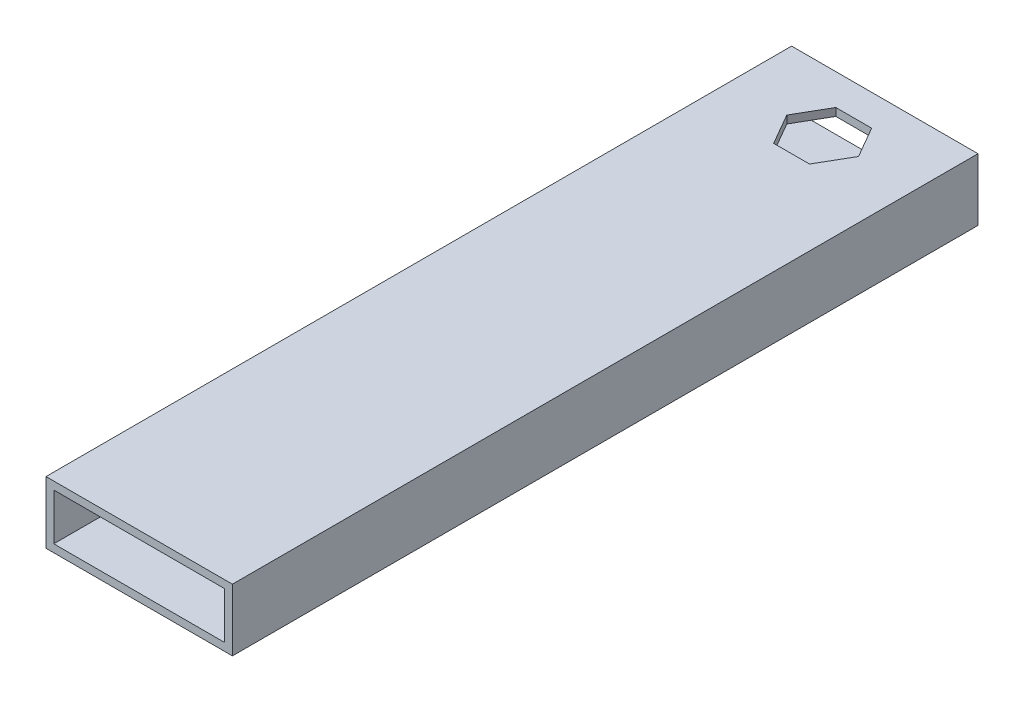
ISO-10303-21;
HEADER;
FILE_DESCRIPTION(('STEP AP214'),'2;1');
FILE_NAME('part.step','',(''),(''),'','','');
FILE_SCHEMA(('AUTOMOTIVE_DESIGN { 1 0 10303 214 1 1 1 1 }'));
ENDSEC;
DATA;
#1=APPLICATION_CONTEXT('core data for automotive mechanical design processes');
#2=APPLICATION_PROTOCOL_DEFINITION('international standard','automotive_design',2000,#1);
#3=PRODUCT_CONTEXT('',#1,'mechanical');
#4=PRODUCT('Part','Part','',(#3));
#5=PRODUCT_RELATED_PRODUCT_CATEGORY('part','',(#4));
#6=PRODUCT_DEFINITION_FORMATION('','',#4);
#7=PRODUCT_DEFINITION_CONTEXT('part definition',#1,'design');
#8=PRODUCT_DEFINITION('design','',#6,#7);
#9=PRODUCT_DEFINITION_SHAPE('','',#8);
#10=(LENGTH_UNIT() NAMED_UNIT(*) SI_UNIT(.MILLI.,.METRE.));
#11=(NAMED_UNIT(*) PLANE_ANGLE_UNIT() SI_UNIT($,.RADIAN.));
#12=(NAMED_UNIT(*) SI_UNIT($,.STERADIAN.) SOLID_ANGLE_UNIT());
#13=UNCERTAINTY_MEASURE_WITH_UNIT(LENGTH_MEASURE(1.E-05),#10,'distance_accuracy_value','');
#14=(GEOMETRIC_REPRESENTATION_CONTEXT(3) GLOBAL_UNCERTAINTY_ASSIGNED_CONTEXT((#13)) GLOBAL_UNIT_ASSIGNED_CONTEXT((#10,
#11,#12)) REPRESENTATION_CONTEXT('',''));
#15=CARTESIAN_POINT('',(0.,0.,0.));
#16=DIRECTION('',(0.,0.,1.));
#17=DIRECTION('',(1.,0.,0.));
#18=AXIS2_PLACEMENT_3D('',#15,#16,#17);
#19=CARTESIAN_POINT('',(0.,0.,152.4));
#20=DIRECTION('',(1.,0.,0.));
#21=DIRECTION('',(0.,0.,-1.));
#22=AXIS2_PLACEMENT_3D('',#19,#20,#21);
#23=PLANE('',#22);
#24=DIRECTION('',(0.,-1.,0.));
#25=VECTOR('',#24,1.);
#26=CARTESIAN_POINT('',(0.,0.,0.));
#27=LINE('',#26,#25);
#28=CARTESIAN_POINT('',(0.,12.7,0.));
#29=VERTEX_POINT('',#28);
#30=CARTESIAN_POINT('',(0.,0.,0.));
#31=VERTEX_POINT('',#30);
#32=EDGE_CURVE('E281',#29,#31,#27,.T.);
#33=ORIENTED_EDGE('',*,*,#32,.T.);
#34=DIRECTION('',(0.,0.,-1.));
#35=VECTOR('',#34,1.);
#36=CARTESIAN_POINT('',(0.,0.,152.4));
#37=LINE('',#36,#35);
#38=CARTESIAN_POINT('',(0.,0.,152.4));
#39=VERTEX_POINT('',#38);
#40=EDGE_CURVE('E314',#39,#31,#37,.T.);
#41=ORIENTED_EDGE('',*,*,#40,.F.);
#42=DIRECTION('',(0.,-1.,0.));
#43=VECTOR('',#42,1.);
#44=CARTESIAN_POINT('',(0.,0.,152.4));
#45=LINE('',#44,#43);
#46=CARTESIAN_POINT('',(0.,12.7,152.4));
#47=VERTEX_POINT('',#46);
#48=EDGE_CURVE('E288',#47,#39,#45,.T.);
#49=ORIENTED_EDGE('',*,*,#48,.F.);
#50=DIRECTION('',(0.,0.,-1.));
#51=VECTOR('',#50,1.);
#52=CARTESIAN_POINT('',(0.,12.7,152.4));
#53=LINE('',#52,#51);
#54=EDGE_CURVE('E298',#47,#29,#53,.T.);
#55=ORIENTED_EDGE('',*,*,#54,.T.);
#56=EDGE_LOOP('',(#33,#41,#49,#55));
#57=FACE_BOUND('',#56,.T.);
#58=ADVANCED_FACE('F36',(#57),#23,.F.);
#59=CARTESIAN_POINT('',(0.,0.,152.4));
#60=DIRECTION('',(0.,1.,0.));
#61=DIRECTION('',(0.,0.,1.));
#62=AXIS2_PLACEMENT_3D('',#59,#60,#61);
#63=PLANE('',#62);
#64=DIRECTION('',(-0.5,0.,0.866025403784439));
#65=VECTOR('',#64,1.);
#66=CARTESIAN_POINT('',(26.3823484187083,0.,12.7));
#67=LINE('',#66,#65);
#68=CARTESIAN_POINT('',(26.3823484187082,0.,12.7));
#69=VERTEX_POINT('',#68);
#70=CARTESIAN_POINT('',(22.7161742093541,0.,19.05));
#71=VERTEX_POINT('',#70);
#72=EDGE_CURVE('E213',#69,#71,#67,.T.);
#73=ORIENTED_EDGE('',*,*,#72,.F.);
#74=DIRECTION('',(0.5,0.,0.866025403784439));
#75=VECTOR('',#74,1.);
#76=CARTESIAN_POINT('',(22.7161742093541,0.,6.34999999999999));
#77=LINE('',#76,#75);
#78=CARTESIAN_POINT('',(22.7161742093541,0.,6.34999999999999));
#79=VERTEX_POINT('',#78);
#80=EDGE_CURVE('E50',#79,#69,#77,.T.);
#81=ORIENTED_EDGE('',*,*,#80,.F.);
#82=DIRECTION('',(1.,0.,0.));
#83=VECTOR('',#82,1.);
#84=CARTESIAN_POINT('',(15.3838257906459,0.,6.34999999999999));
#85=LINE('',#84,#83);
#86=CARTESIAN_POINT('',(15.3838257906459,0.,6.34999999999999));
#87=VERTEX_POINT('',#86);
#88=EDGE_CURVE('E199',#87,#79,#85,.T.);
#89=ORIENTED_EDGE('',*,*,#88,.F.);
#90=DIRECTION('',(0.500000000000001,0.,-0.866025403784438));
#91=VECTOR('',#90,1.);
#92=CARTESIAN_POINT('',(11.7176515812918,0.,12.7));
#93=LINE('',#92,#91);
#94=CARTESIAN_POINT('',(11.7176515812918,0.,12.7));
#95=VERTEX_POINT('',#94);
#96=EDGE_CURVE('E202',#95,#87,#93,.T.);
#97=ORIENTED_EDGE('',*,*,#96,.F.);
#98=DIRECTION('',(-0.499999999999999,0.,-0.866025403784439));
#99=VECTOR('',#98,1.);
#100=CARTESIAN_POINT('',(15.3838257906459,0.,19.05));
#101=LINE('',#100,#99);
#102=CARTESIAN_POINT('',(15.3838257906459,0.,19.05));
#103=VERTEX_POINT('',#102);
#104=EDGE_CURVE('E219',#103,#95,#101,.T.);
#105=ORIENTED_EDGE('',*,*,#104,.F.);
#106=DIRECTION('',(-1.,0.,0.));
#107=VECTOR('',#106,1.);
#108=CARTESIAN_POINT('',(22.7161742093541,0.,19.05));
#109=LINE('',#108,#107);
#110=EDGE_CURVE('E216',#71,#103,#109,.T.);
#111=ORIENTED_EDGE('',*,*,#110,.F.);
#112=EDGE_LOOP('',(#73,#81,#89,#97,#105,#111));
#113=FACE_BOUND('',#112,.T.);
#114=DIRECTION('',(1.,0.,0.));
#115=VECTOR('',#114,1.);
#116=CARTESIAN_POINT('',(0.,0.,0.));
#117=LINE('',#116,#115);
#118=CARTESIAN_POINT('',(38.1,0.,0.));
#119=VERTEX_POINT('',#118);
#120=EDGE_CURVE('E301',#31,#119,#117,.T.);
#121=ORIENTED_EDGE('',*,*,#120,.T.);
#122=DIRECTION('',(0.,0.,-1.));
#123=VECTOR('',#122,1.);
#124=CARTESIAN_POINT('',(38.1,0.,152.4));
#125=LINE('',#124,#123);
#126=CARTESIAN_POINT('',(38.1,0.,152.4));
#127=VERTEX_POINT('',#126);
#128=EDGE_CURVE('E311',#127,#119,#125,.T.);
#129=ORIENTED_EDGE('',*,*,#128,.F.);
#130=DIRECTION('',(1.,0.,0.));
#131=VECTOR('',#130,1.);
#132=CARTESIAN_POINT('',(0.,0.,152.4));
#133=LINE('',#132,#131);
#134=EDGE_CURVE('E291',#39,#127,#133,.T.);
#135=ORIENTED_EDGE('',*,*,#134,.F.);
#136=ORIENTED_EDGE('',*,*,#40,.T.);
#137=EDGE_LOOP('',(#121,#129,#135,#136));
#138=FACE_BOUND('',#137,.T.);
#139=ADVANCED_FACE('F344',(#113,#138),#63,.F.);
#140=CARTESIAN_POINT('',(38.1,0.,152.4));
#141=DIRECTION('',(-1.,0.,0.));
#142=DIRECTION('',(0.,0.,1.));
#143=AXIS2_PLACEMENT_3D('',#140,#141,#142);
#144=PLANE('',#143);
#145=DIRECTION('',(0.,1.,0.));
#146=VECTOR('',#145,1.);
#147=CARTESIAN_POINT('',(38.1,0.,0.));
#148=LINE('',#147,#146);
#149=CARTESIAN_POINT('',(38.1,12.7,0.));
#150=VERTEX_POINT('',#149);
#151=EDGE_CURVE('E303',#119,#150,#148,.T.);
#152=ORIENTED_EDGE('',*,*,#151,.T.);
#153=DIRECTION('',(0.,0.,-1.));
#154=VECTOR('',#153,1.);
#155=CARTESIAN_POINT('',(38.1,12.7,152.4));
#156=LINE('',#155,#154);
#157=CARTESIAN_POINT('',(38.1,12.7,152.4));
#158=VERTEX_POINT('',#157);
#159=EDGE_CURVE('E308',#158,#150,#156,.T.);
#160=ORIENTED_EDGE('',*,*,#159,.F.);
#161=DIRECTION('',(0.,1.,0.));
#162=VECTOR('',#161,1.);
#163=CARTESIAN_POINT('',(38.1,0.,152.4));
#164=LINE('',#163,#162);
#165=EDGE_CURVE('E294',#127,#158,#164,.T.);
#166=ORIENTED_EDGE('',*,*,#165,.F.);
#167=ORIENTED_EDGE('',*,*,#128,.T.);
#168=EDGE_LOOP('',(#152,#160,#166,#167));
#169=FACE_BOUND('',#168,.T.);
#170=ADVANCED_FACE('F366',(#169),#144,.F.);
#171=CARTESIAN_POINT('',(0.,12.7,152.4));
#172=DIRECTION('',(0.,-1.,0.));
#173=DIRECTION('',(0.,0.,-1.));
#174=AXIS2_PLACEMENT_3D('',#171,#172,#173);
#175=PLANE('',#174);
#176=DIRECTION('',(1.,0.,0.));
#177=VECTOR('',#176,1.);
#178=CARTESIAN_POINT('',(15.3838257906459,12.7,6.34999999999999));
#179=LINE('',#178,#177);
#180=CARTESIAN_POINT('',(15.3838257906459,12.7,6.34999999999999));
#181=VERTEX_POINT('',#180);
#182=CARTESIAN_POINT('',(22.7161742093541,12.7,6.34999999999999));
#183=VERTEX_POINT('',#182);
#184=EDGE_CURVE('E198',#181,#183,#179,.T.);
#185=ORIENTED_EDGE('',*,*,#184,.T.);
#186=DIRECTION('',(0.5,0.,0.866025403784439));
#187=VECTOR('',#186,1.);
#188=CARTESIAN_POINT('',(22.7161742093541,12.7,6.34999999999999));
#189=LINE('',#188,#187);
#190=CARTESIAN_POINT('',(26.3823484187083,12.7,12.7));
#191=VERTEX_POINT('',#190);
#192=EDGE_CURVE('E179',#183,#191,#189,.T.);
#193=ORIENTED_EDGE('',*,*,#192,.T.);
#194=DIRECTION('',(-0.5,0.,0.866025403784439));
#195=VECTOR('',#194,1.);
#196=CARTESIAN_POINT('',(26.3823484187083,12.7,12.7));
#197=LINE('',#196,#195);
#198=CARTESIAN_POINT('',(22.7161742093541,12.7,19.05));
#199=VERTEX_POINT('',#198);
#200=EDGE_CURVE('E189',#191,#199,#197,.T.);
#201=ORIENTED_EDGE('',*,*,#200,.T.);
#202=DIRECTION('',(-1.,0.,0.));
#203=VECTOR('',#202,1.);
#204=CARTESIAN_POINT('',(22.7161742093541,12.7,19.05));
#205=LINE('',#204,#203);
#206=CARTESIAN_POINT('',(15.3838257906459,12.7,19.05));
#207=VERTEX_POINT('',#206);
#208=EDGE_CURVE('E58',#199,#207,#205,.T.);
#209=ORIENTED_EDGE('',*,*,#208,.T.);
#210=DIRECTION('',(-0.499999999999999,0.,-0.866025403784439));
#211=VECTOR('',#210,1.);
#212=CARTESIAN_POINT('',(15.3838257906459,12.7,19.05));
#213=LINE('',#212,#211);
#214=CARTESIAN_POINT('',(11.7176515812918,12.7,12.7));
#215=VERTEX_POINT('',#214);
#216=EDGE_CURVE('E206',#207,#215,#213,.T.);
#217=ORIENTED_EDGE('',*,*,#216,.T.);
#218=DIRECTION('',(0.500000000000001,0.,-0.866025403784438));
#219=VECTOR('',#218,1.);
#220=CARTESIAN_POINT('',(11.7176515812918,12.7,12.7));
#221=LINE('',#220,#219);
#222=EDGE_CURVE('E209',#215,#181,#221,.T.);
#223=ORIENTED_EDGE('',*,*,#222,.T.);
#224=EDGE_LOOP('',(#185,#193,#201,#209,#217,#223));
#225=FACE_BOUND('',#224,.T.);
#226=DIRECTION('',(-1.,0.,0.));
#227=VECTOR('',#226,1.);
#228=CARTESIAN_POINT('',(0.,12.7,0.));
#229=LINE('',#228,#227);
#230=EDGE_CURVE('E292',#150,#29,#229,.T.);
#231=ORIENTED_EDGE('',*,*,#230,.T.);
#232=ORIENTED_EDGE('',*,*,#54,.F.);
#233=DIRECTION('',(-1.,0.,0.));
#234=VECTOR('',#233,1.);
#235=CARTESIAN_POINT('',(0.,12.7,152.4));
#236=LINE('',#235,#234);
#237=EDGE_CURVE('E296',#158,#47,#236,.T.);
#238=ORIENTED_EDGE('',*,*,#237,.F.);
#239=ORIENTED_EDGE('',*,*,#159,.T.);
#240=EDGE_LOOP('',(#231,#232,#238,#239));
#241=FACE_BOUND('',#240,.T.);
#242=ADVANCED_FACE('F194',(#225,#241),#175,.F.);
#243=CARTESIAN_POINT('',(0.,0.,152.4));
#244=DIRECTION('',(0.,0.,-1.));
#245=DIRECTION('',(-1.,0.,0.));
#246=AXIS2_PLACEMENT_3D('',#243,#244,#245);
#247=PLANE('',#246);
#248=DIRECTION('',(0.,-1.,0.));
#249=VECTOR('',#248,1.);
#250=CARTESIAN_POINT('',(1.5875,11.1125,152.4));
#251=LINE('',#250,#249);
#252=CARTESIAN_POINT('',(1.5875,11.1125,152.4));
#253=VERTEX_POINT('',#252);
#254=CARTESIAN_POINT('',(1.5875,1.5875,152.4));
#255=VERTEX_POINT('',#254);
#256=EDGE_CURVE('E271',#253,#255,#251,.T.);
#257=ORIENTED_EDGE('',*,*,#256,.F.);
#258=DIRECTION('',(-1.,0.,0.));
#259=VECTOR('',#258,1.);
#260=CARTESIAN_POINT('',(36.5125,11.1125,152.4));
#261=LINE('',#260,#259);
#262=CARTESIAN_POINT('',(36.5125,11.1125,152.4));
#263=VERTEX_POINT('',#262);
#264=EDGE_CURVE('E255',#263,#253,#261,.T.);
#265=ORIENTED_EDGE('',*,*,#264,.F.);
#266=DIRECTION('',(0.,1.,0.));
#267=VECTOR('',#266,1.);
#268=CARTESIAN_POINT('',(36.5125,1.5875,152.4));
#269=LINE('',#268,#267);
#270=CARTESIAN_POINT('',(36.5125,1.5875,152.4));
#271=VERTEX_POINT('',#270);
#272=EDGE_CURVE('E260',#271,#263,#269,.T.);
#273=ORIENTED_EDGE('',*,*,#272,.F.);
#274=DIRECTION('',(1.,0.,0.));
#275=VECTOR('',#274,1.);
#276=CARTESIAN_POINT('',(1.5875,1.5875,152.4));
#277=LINE('',#276,#275);
#278=EDGE_CURVE('E274',#255,#271,#277,.T.);
#279=ORIENTED_EDGE('',*,*,#278,.F.);
#280=EDGE_LOOP('',(#257,#265,#273,#279));
#281=FACE_BOUND('',#280,.T.);
#282=ORIENTED_EDGE('',*,*,#48,.T.);
#283=ORIENTED_EDGE('',*,*,#134,.T.);
#284=ORIENTED_EDGE('',*,*,#165,.T.);
#285=ORIENTED_EDGE('',*,*,#237,.T.);
#286=EDGE_LOOP('',(#282,#283,#284,#285));
#287=FACE_BOUND('',#286,.T.);
#288=ADVANCED_FACE('F378',(#281,#287),#247,.F.);
#289=CARTESIAN_POINT('',(0.,0.,0.));
#290=DIRECTION('',(0.,0.,-1.));
#291=DIRECTION('',(-1.,0.,0.));
#292=AXIS2_PLACEMENT_3D('',#289,#290,#291);
#293=PLANE('',#292);
#294=DIRECTION('',(-1.,0.,0.));
#295=VECTOR('',#294,1.);
#296=CARTESIAN_POINT('',(36.5125,11.1125,0.));
#297=LINE('',#296,#295);
#298=CARTESIAN_POINT('',(36.5125,11.1125,0.));
#299=VERTEX_POINT('',#298);
#300=CARTESIAN_POINT('',(1.5875,11.1125,0.));
#301=VERTEX_POINT('',#300);
#302=EDGE_CURVE('E256',#299,#301,#297,.T.);
#303=ORIENTED_EDGE('',*,*,#302,.T.);
#304=DIRECTION('',(0.,-1.,0.));
#305=VECTOR('',#304,1.);
#306=CARTESIAN_POINT('',(1.5875,11.1125,0.));
#307=LINE('',#306,#305);
#308=CARTESIAN_POINT('',(1.5875,1.5875,0.));
#309=VERTEX_POINT('',#308);
#310=EDGE_CURVE('E259',#301,#309,#307,.T.);
#311=ORIENTED_EDGE('',*,*,#310,.T.);
#312=DIRECTION('',(1.,0.,0.));
#313=VECTOR('',#312,1.);
#314=CARTESIAN_POINT('',(1.5875,1.5875,0.));
#315=LINE('',#314,#313);
#316=CARTESIAN_POINT('',(36.5125,1.5875,0.));
#317=VERTEX_POINT('',#316);
#318=EDGE_CURVE('E263',#309,#317,#315,.T.);
#319=ORIENTED_EDGE('',*,*,#318,.T.);
#320=DIRECTION('',(0.,1.,0.));
#321=VECTOR('',#320,1.);
#322=CARTESIAN_POINT('',(36.5125,1.5875,0.));
#323=LINE('',#322,#321);
#324=EDGE_CURVE('E266',#317,#299,#323,.T.);
#325=ORIENTED_EDGE('',*,*,#324,.T.);
#326=EDGE_LOOP('',(#303,#311,#319,#325));
#327=FACE_BOUND('',#326,.T.);
#328=ORIENTED_EDGE('',*,*,#32,.F.);
#329=ORIENTED_EDGE('',*,*,#230,.F.);
#330=ORIENTED_EDGE('',*,*,#151,.F.);
#331=ORIENTED_EDGE('',*,*,#120,.F.);
#332=EDGE_LOOP('',(#328,#329,#330,#331));
#333=FACE_BOUND('',#332,.T.);
#334=ADVANCED_FACE('F373',(#327,#333),#293,.T.);
#335=CARTESIAN_POINT('',(36.5125,11.1125,0.));
#336=DIRECTION('',(0.,1.,0.));
#337=DIRECTION('',(0.,0.,1.));
#338=AXIS2_PLACEMENT_3D('',#335,#336,#337);
#339=PLANE('',#338);
#340=DIRECTION('',(0.5,0.,-0.866025403784439));
#341=VECTOR('',#340,1.);
#342=CARTESIAN_POINT('',(34.4141476280624,11.1125,-1.21148430679288));
#343=LINE('',#342,#341);
#344=CARTESIAN_POINT('',(22.7161742093541,11.1125,19.05));
#345=VERTEX_POINT('',#344);
#346=CARTESIAN_POINT('',(26.3823484187082,11.1125,12.7));
#347=VERTEX_POINT('',#346);
#348=EDGE_CURVE('E226',#345,#347,#343,.T.);
#349=ORIENTED_EDGE('',*,*,#348,.T.);
#350=DIRECTION('',(-0.5,0.,-0.866025403784439));
#351=VECTOR('',#350,1.);
#352=CARTESIAN_POINT('',(23.415625,11.1125,7.56148430679287));
#353=LINE('',#352,#351);
#354=CARTESIAN_POINT('',(22.7161742093541,11.1125,6.34999999999999));
#355=VERTEX_POINT('',#354);
#356=EDGE_CURVE('E182',#347,#355,#353,.T.);
#357=ORIENTED_EDGE('',*,*,#356,.T.);
#358=DIRECTION('',(-1.,0.,0.));
#359=VECTOR('',#358,1.);
#360=CARTESIAN_POINT('',(36.5125,11.1125,6.34999999999999));
#361=LINE('',#360,#359);
#362=CARTESIAN_POINT('',(15.3838257906459,11.1125,6.34999999999999));
#363=VERTEX_POINT('',#362);
#364=EDGE_CURVE('E251',#355,#363,#361,.T.);
#365=ORIENTED_EDGE('',*,*,#364,.T.);
#366=DIRECTION('',(-0.500000000000001,0.,0.866025403784438));
#367=VECTOR('',#366,1.);
#368=CARTESIAN_POINT('',(23.415625,11.1125,-7.56148430679288));
#369=LINE('',#368,#367);
#370=CARTESIAN_POINT('',(11.7176515812918,11.1125,12.7));
#371=VERTEX_POINT('',#370);
#372=EDGE_CURVE('E248',#363,#371,#369,.T.);
#373=ORIENTED_EDGE('',*,*,#372,.T.);
#374=DIRECTION('',(0.499999999999999,0.,0.866025403784439));
#375=VECTOR('',#374,1.);
#376=CARTESIAN_POINT('',(12.4171023719376,11.1125,13.9114843067929));
#377=LINE('',#376,#375);
#378=CARTESIAN_POINT('',(15.3838257906459,11.1125,19.05));
#379=VERTEX_POINT('',#378);
#380=EDGE_CURVE('E245',#371,#379,#377,.T.);
#381=ORIENTED_EDGE('',*,*,#380,.T.);
#382=DIRECTION('',(1.,0.,0.));
#383=VECTOR('',#382,1.);
#384=CARTESIAN_POINT('',(36.5125,11.1125,19.05));
#385=LINE('',#384,#383);
#386=EDGE_CURVE('E242',#379,#345,#385,.T.);
#387=ORIENTED_EDGE('',*,*,#386,.T.);
#388=EDGE_LOOP('',(#349,#357,#365,#373,#381,#387));
#389=FACE_BOUND('',#388,.T.);
#390=ORIENTED_EDGE('',*,*,#264,.T.);
#391=DIRECTION('',(0.,0.,1.));
#392=VECTOR('',#391,1.);
#393=CARTESIAN_POINT('',(1.5875,11.1125,0.));
#394=LINE('',#393,#392);
#395=EDGE_CURVE('E269',#301,#253,#394,.T.);
#396=ORIENTED_EDGE('',*,*,#395,.F.);
#397=ORIENTED_EDGE('',*,*,#302,.F.);
#398=DIRECTION('',(0.,0.,1.));
#399=VECTOR('',#398,1.);
#400=CARTESIAN_POINT('',(36.5125,11.1125,0.));
#401=LINE('',#400,#399);
#402=EDGE_CURVE('E279',#299,#263,#401,.T.);
#403=ORIENTED_EDGE('',*,*,#402,.T.);
#404=EDGE_LOOP('',(#390,#396,#397,#403));
#405=FACE_BOUND('',#404,.T.);
#406=ADVANCED_FACE('F391',(#389,#405),#339,.F.);
#407=CARTESIAN_POINT('',(36.5125,1.5875,0.));
#408=DIRECTION('',(1.,0.,0.));
#409=DIRECTION('',(0.,0.,-1.));
#410=AXIS2_PLACEMENT_3D('',#407,#408,#409);
#411=PLANE('',#410);
#412=ORIENTED_EDGE('',*,*,#272,.T.);
#413=ORIENTED_EDGE('',*,*,#402,.F.);
#414=ORIENTED_EDGE('',*,*,#324,.F.);
#415=DIRECTION('',(0.,0.,1.));
#416=VECTOR('',#415,1.);
#417=CARTESIAN_POINT('',(36.5125,1.5875,0.));
#418=LINE('',#417,#416);
#419=EDGE_CURVE('E282',#317,#271,#418,.T.);
#420=ORIENTED_EDGE('',*,*,#419,.T.);
#421=EDGE_LOOP('',(#412,#413,#414,#420));
#422=FACE_BOUND('',#421,.T.);
#423=ADVANCED_FACE('F398',(#422),#411,.F.);
#424=CARTESIAN_POINT('',(1.5875,1.5875,0.));
#425=DIRECTION('',(0.,-1.,0.));
#426=DIRECTION('',(0.,0.,-1.));
#427=AXIS2_PLACEMENT_3D('',#424,#425,#426);
#428=PLANE('',#427);
#429=DIRECTION('',(1.,0.,0.));
#430=VECTOR('',#429,1.);
#431=CARTESIAN_POINT('',(1.5875,1.5875,6.34999999999999));
#432=LINE('',#431,#430);
#433=CARTESIAN_POINT('',(15.3838257906459,1.5875,6.34999999999999));
#434=VERTEX_POINT('',#433);
#435=CARTESIAN_POINT('',(22.7161742093541,1.5875,6.34999999999999));
#436=VERTEX_POINT('',#435);
#437=EDGE_CURVE('E43',#434,#436,#432,.T.);
#438=ORIENTED_EDGE('',*,*,#437,.T.);
#439=DIRECTION('',(0.5,0.,0.866025403784439));
#440=VECTOR('',#439,1.);
#441=CARTESIAN_POINT('',(14.684375,1.5875,-7.56148430679288));
#442=LINE('',#441,#440);
#443=CARTESIAN_POINT('',(26.3823484187083,1.5875,12.7));
#444=VERTEX_POINT('',#443);
#445=EDGE_CURVE('E11',#436,#444,#442,.T.);
#446=ORIENTED_EDGE('',*,*,#445,.T.);
#447=DIRECTION('',(-0.5,0.,0.866025403784439));
#448=VECTOR('',#447,1.);
#449=CARTESIAN_POINT('',(25.6828976280624,1.5875,13.9114843067929));
#450=LINE('',#449,#448);
#451=CARTESIAN_POINT('',(22.7161742093541,1.5875,19.05));
#452=VERTEX_POINT('',#451);
#453=EDGE_CURVE('E317',#444,#452,#450,.T.);
#454=ORIENTED_EDGE('',*,*,#453,.T.);
#455=DIRECTION('',(-1.,0.,0.));
#456=VECTOR('',#455,1.);
#457=CARTESIAN_POINT('',(1.5875,1.5875,19.05));
#458=LINE('',#457,#456);
#459=CARTESIAN_POINT('',(15.3838257906459,1.5875,19.05));
#460=VERTEX_POINT('',#459);
#461=EDGE_CURVE('E320',#452,#460,#458,.T.);
#462=ORIENTED_EDGE('',*,*,#461,.T.);
#463=DIRECTION('',(-0.499999999999999,0.,-0.866025403784439));
#464=VECTOR('',#463,1.);
#465=CARTESIAN_POINT('',(3.68585237193765,1.5875,-1.21148430679289));
#466=LINE('',#465,#464);
#467=CARTESIAN_POINT('',(11.7176515812918,1.5875,12.7));
#468=VERTEX_POINT('',#467);
#469=EDGE_CURVE('E323',#460,#468,#466,.T.);
#470=ORIENTED_EDGE('',*,*,#469,.T.);
#471=DIRECTION('',(0.500000000000001,0.,-0.866025403784438));
#472=VECTOR('',#471,1.);
#473=CARTESIAN_POINT('',(14.684375,1.5875,7.56148430679289));
#474=LINE('',#473,#472);
#475=EDGE_CURVE('E326',#468,#434,#474,.T.);
#476=ORIENTED_EDGE('',*,*,#475,.T.);
#477=EDGE_LOOP('',(#438,#446,#454,#462,#470,#476));
#478=FACE_BOUND('',#477,.T.);
#479=ORIENTED_EDGE('',*,*,#278,.T.);
#480=ORIENTED_EDGE('',*,*,#419,.F.);
#481=ORIENTED_EDGE('',*,*,#318,.F.);
#482=DIRECTION('',(0.,0.,1.));
#483=VECTOR('',#482,1.);
#484=CARTESIAN_POINT('',(1.5875,1.5875,0.));
#485=LINE('',#484,#483);
#486=EDGE_CURVE('E284',#309,#255,#485,.T.);
#487=ORIENTED_EDGE('',*,*,#486,.T.);
#488=EDGE_LOOP('',(#479,#480,#481,#487));
#489=FACE_BOUND('',#488,.T.);
#490=ADVANCED_FACE('F330',(#478,#489),#428,.F.);
#491=CARTESIAN_POINT('',(1.5875,11.1125,0.));
#492=DIRECTION('',(-1.,0.,0.));
#493=DIRECTION('',(0.,0.,1.));
#494=AXIS2_PLACEMENT_3D('',#491,#492,#493);
#495=PLANE('',#494);
#496=ORIENTED_EDGE('',*,*,#256,.T.);
#497=ORIENTED_EDGE('',*,*,#486,.F.);
#498=ORIENTED_EDGE('',*,*,#310,.F.);
#499=ORIENTED_EDGE('',*,*,#395,.T.);
#500=EDGE_LOOP('',(#496,#497,#498,#499));
#501=FACE_BOUND('',#500,.T.);
#502=ADVANCED_FACE('F400',(#501),#495,.F.);
#503=CARTESIAN_POINT('',(26.3823484187083,12.7,12.7));
#504=DIRECTION('',(0.866025403784438,0.,0.5));
#505=DIRECTION('',(0.5,0.,-0.866025403784439));
#506=AXIS2_PLACEMENT_3D('',#503,#504,#505);
#507=PLANE('',#506);
#508=DIRECTION('',(0.,-1.,0.));
#509=VECTOR('',#508,1.);
#510=CARTESIAN_POINT('',(26.3823484187083,12.7,12.7));
#511=LINE('',#510,#509);
#512=EDGE_CURVE('E186',#444,#69,#511,.T.);
#513=ORIENTED_EDGE('',*,*,#512,.T.);
#514=ORIENTED_EDGE('',*,*,#72,.T.);
#515=DIRECTION('',(0.,-1.,0.));
#516=VECTOR('',#515,1.);
#517=CARTESIAN_POINT('',(22.7161742093541,12.7,19.05));
#518=LINE('',#517,#516);
#519=EDGE_CURVE('E185',#452,#71,#518,.T.);
#520=ORIENTED_EDGE('',*,*,#519,.F.);
#521=ORIENTED_EDGE('',*,*,#453,.F.);
#522=EDGE_LOOP('',(#513,#514,#520,#521));
#523=FACE_BOUND('',#522,.T.);
#524=ADVANCED_FACE('F348',(#523),#507,.F.);
#525=CARTESIAN_POINT('',(22.7161742093541,12.7,19.05));
#526=DIRECTION('',(0.,0.,1.));
#527=DIRECTION('',(1.,0.,0.));
#528=AXIS2_PLACEMENT_3D('',#525,#526,#527);
#529=PLANE('',#528);
#530=ORIENTED_EDGE('',*,*,#519,.T.);
#531=ORIENTED_EDGE('',*,*,#110,.T.);
#532=DIRECTION('',(0.,-1.,0.));
#533=VECTOR('',#532,1.);
#534=CARTESIAN_POINT('',(15.3838257906459,12.7,19.05));
#535=LINE('',#534,#533);
#536=EDGE_CURVE('E239',#460,#103,#535,.T.);
#537=ORIENTED_EDGE('',*,*,#536,.F.);
#538=ORIENTED_EDGE('',*,*,#461,.F.);
#539=EDGE_LOOP('',(#530,#531,#537,#538));
#540=FACE_BOUND('',#539,.T.);
#541=ADVANCED_FACE('F436',(#540),#529,.F.);
#542=CARTESIAN_POINT('',(15.3838257906459,12.7,19.05));
#543=DIRECTION('',(-0.866025403784439,0.,0.499999999999999));
#544=DIRECTION('',(0.499999999999999,0.,0.866025403784439));
#545=AXIS2_PLACEMENT_3D('',#542,#543,#544);
#546=PLANE('',#545);
#547=ORIENTED_EDGE('',*,*,#536,.T.);
#548=ORIENTED_EDGE('',*,*,#104,.T.);
#549=DIRECTION('',(0.,-1.,0.));
#550=VECTOR('',#549,1.);
#551=CARTESIAN_POINT('',(11.7176515812918,12.7,12.7));
#552=LINE('',#551,#550);
#553=EDGE_CURVE('E235',#468,#95,#552,.T.);
#554=ORIENTED_EDGE('',*,*,#553,.F.);
#555=ORIENTED_EDGE('',*,*,#469,.F.);
#556=EDGE_LOOP('',(#547,#548,#554,#555));
#557=FACE_BOUND('',#556,.T.);
#558=ADVANCED_FACE('F442',(#557),#546,.F.);
#559=CARTESIAN_POINT('',(11.7176515812918,12.7,12.7));
#560=DIRECTION('',(-0.866025403784438,0.,-0.500000000000001));
#561=DIRECTION('',(-0.500000000000001,0.,0.866025403784438));
#562=AXIS2_PLACEMENT_3D('',#559,#560,#561);
#563=PLANE('',#562);
#564=ORIENTED_EDGE('',*,*,#553,.T.);
#565=ORIENTED_EDGE('',*,*,#96,.T.);
#566=DIRECTION('',(0.,-1.,0.));
#567=VECTOR('',#566,1.);
#568=CARTESIAN_POINT('',(15.3838257906459,12.7,6.34999999999999));
#569=LINE('',#568,#567);
#570=EDGE_CURVE('E231',#434,#87,#569,.T.);
#571=ORIENTED_EDGE('',*,*,#570,.F.);
#572=ORIENTED_EDGE('',*,*,#475,.F.);
#573=EDGE_LOOP('',(#564,#565,#571,#572));
#574=FACE_BOUND('',#573,.T.);
#575=ADVANCED_FACE('F337',(#574),#563,.F.);
#576=CARTESIAN_POINT('',(15.3838257906459,12.7,6.34999999999999));
#577=DIRECTION('',(0.,0.,-1.));
#578=DIRECTION('',(-1.,0.,0.));
#579=AXIS2_PLACEMENT_3D('',#576,#577,#578);
#580=PLANE('',#579);
#581=ORIENTED_EDGE('',*,*,#570,.T.);
#582=ORIENTED_EDGE('',*,*,#88,.T.);
#583=DIRECTION('',(0.,-1.,0.));
#584=VECTOR('',#583,1.);
#585=CARTESIAN_POINT('',(22.7161742093541,12.7,6.34999999999999));
#586=LINE('',#585,#584);
#587=EDGE_CURVE('E227',#436,#79,#586,.T.);
#588=ORIENTED_EDGE('',*,*,#587,.F.);
#589=ORIENTED_EDGE('',*,*,#437,.F.);
#590=EDGE_LOOP('',(#581,#582,#588,#589));
#591=FACE_BOUND('',#590,.T.);
#592=ADVANCED_FACE('F335',(#591),#580,.F.);
#593=CARTESIAN_POINT('',(22.7161742093541,12.7,6.34999999999999));
#594=DIRECTION('',(0.866025403784439,0.,-0.5));
#595=DIRECTION('',(-0.5,0.,-0.866025403784439));
#596=AXIS2_PLACEMENT_3D('',#593,#594,#595);
#597=PLANE('',#596);
#598=ORIENTED_EDGE('',*,*,#587,.T.);
#599=ORIENTED_EDGE('',*,*,#80,.T.);
#600=ORIENTED_EDGE('',*,*,#512,.F.);
#601=ORIENTED_EDGE('',*,*,#445,.F.);
#602=EDGE_LOOP('',(#598,#599,#600,#601));
#603=FACE_BOUND('',#602,.T.);
#604=ADVANCED_FACE('F350',(#603),#597,.F.);
#605=EDGE_CURVE('E174',#191,#347,#511,.T.);
#606=ORIENTED_EDGE('',*,*,#605,.F.);
#607=ORIENTED_EDGE('',*,*,#192,.F.);
#608=EDGE_CURVE('E224',#183,#355,#586,.T.);
#609=ORIENTED_EDGE('',*,*,#608,.T.);
#610=ORIENTED_EDGE('',*,*,#356,.F.);
#611=EDGE_LOOP('',(#606,#607,#609,#610));
#612=FACE_BOUND('',#611,.T.);
#613=ADVANCED_FACE('F176',(#612),#597,.F.);
#614=ORIENTED_EDGE('',*,*,#608,.F.);
#615=ORIENTED_EDGE('',*,*,#184,.F.);
#616=EDGE_CURVE('E228',#181,#363,#569,.T.);
#617=ORIENTED_EDGE('',*,*,#616,.T.);
#618=ORIENTED_EDGE('',*,*,#364,.F.);
#619=EDGE_LOOP('',(#614,#615,#617,#618));
#620=FACE_BOUND('',#619,.T.);
#621=ADVANCED_FACE('F357',(#620),#580,.F.);
#622=ORIENTED_EDGE('',*,*,#616,.F.);
#623=ORIENTED_EDGE('',*,*,#222,.F.);
#624=EDGE_CURVE('E232',#215,#371,#552,.T.);
#625=ORIENTED_EDGE('',*,*,#624,.T.);
#626=ORIENTED_EDGE('',*,*,#372,.F.);
#627=EDGE_LOOP('',(#622,#623,#625,#626));
#628=FACE_BOUND('',#627,.T.);
#629=ADVANCED_FACE('F459',(#628),#563,.F.);
#630=ORIENTED_EDGE('',*,*,#624,.F.);
#631=ORIENTED_EDGE('',*,*,#216,.F.);
#632=EDGE_CURVE('E236',#207,#379,#535,.T.);
#633=ORIENTED_EDGE('',*,*,#632,.T.);
#634=ORIENTED_EDGE('',*,*,#380,.F.);
#635=EDGE_LOOP('',(#630,#631,#633,#634));
#636=FACE_BOUND('',#635,.T.);
#637=ADVANCED_FACE('F453',(#636),#546,.F.);
#638=ORIENTED_EDGE('',*,*,#632,.F.);
#639=ORIENTED_EDGE('',*,*,#208,.F.);
#640=EDGE_CURVE('E191',#199,#345,#518,.T.);
#641=ORIENTED_EDGE('',*,*,#640,.T.);
#642=ORIENTED_EDGE('',*,*,#386,.F.);
#643=EDGE_LOOP('',(#638,#639,#641,#642));
#644=FACE_BOUND('',#643,.T.);
#645=ADVANCED_FACE('F445',(#644),#529,.F.);
#646=ORIENTED_EDGE('',*,*,#640,.F.);
#647=ORIENTED_EDGE('',*,*,#200,.F.);
#648=ORIENTED_EDGE('',*,*,#605,.T.);
#649=ORIENTED_EDGE('',*,*,#348,.F.);
#650=EDGE_LOOP('',(#646,#647,#648,#649));
#651=FACE_BOUND('',#650,.T.);
#652=ADVANCED_FACE('F190',(#651),#507,.F.);
#653=CLOSED_SHELL('',(#58,#139,#170,#242,#288,#334,#406,#423,#490,#502,#524,#541,#558,#575,#592,
#604,#613,#621,#629,#637,#645,#652));
#654=MANIFOLD_SOLID_BREP('B2',#653);
#655=ADVANCED_BREP_SHAPE_REPRESENTATION('',(#18,#654),#14);
#656=SHAPE_DEFINITION_REPRESENTATION(#9,#655);
ENDSEC;
END-ISO-10303-21;
